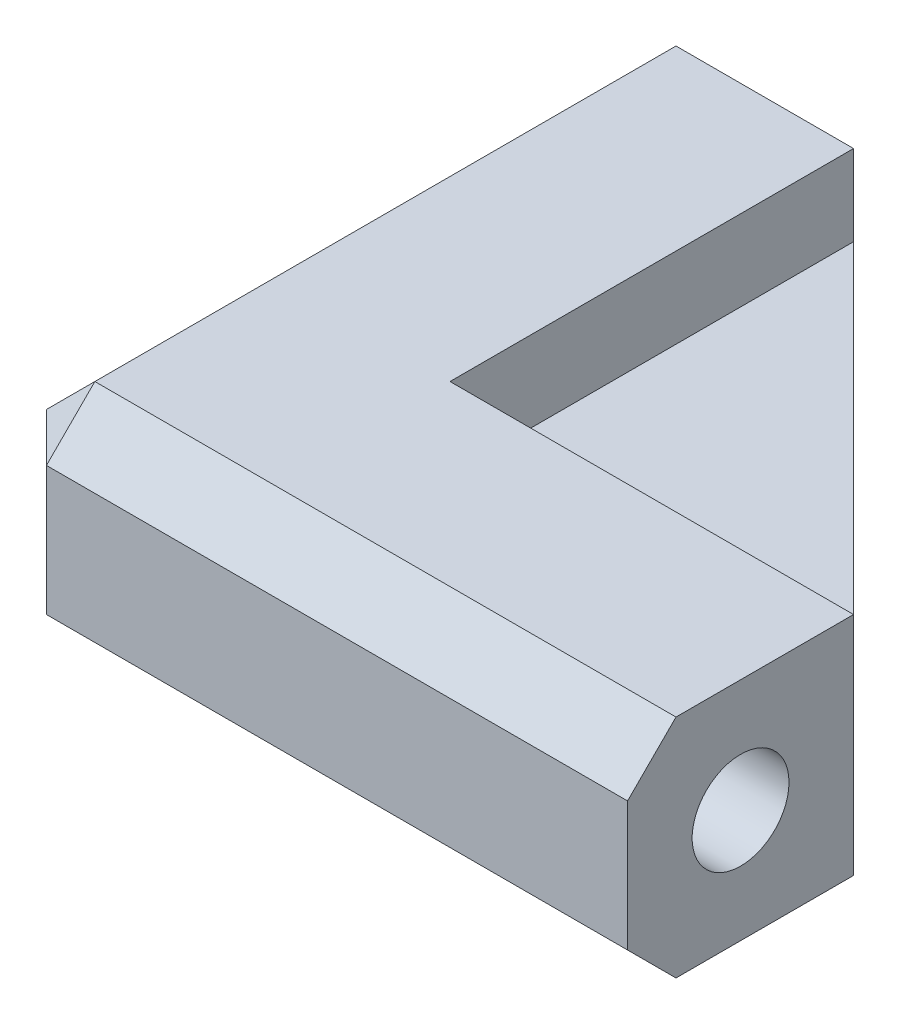
ISO-10303-21;
HEADER;
FILE_DESCRIPTION(('STEP AP214'),'2;1');
FILE_NAME('part.step','',(''),(''),'','','');
FILE_SCHEMA(('AUTOMOTIVE_DESIGN { 1 0 10303 214 1 1 1 1 }'));
ENDSEC;
DATA;
#1=APPLICATION_CONTEXT('core data for automotive mechanical design processes');
#2=APPLICATION_PROTOCOL_DEFINITION('international standard','automotive_design',2000,#1);
#3=PRODUCT_CONTEXT('',#1,'mechanical');
#4=PRODUCT('Part','Part','',(#3));
#5=PRODUCT_RELATED_PRODUCT_CATEGORY('part','',(#4));
#6=PRODUCT_DEFINITION_FORMATION('','',#4);
#7=PRODUCT_DEFINITION_CONTEXT('part definition',#1,'design');
#8=PRODUCT_DEFINITION('design','',#6,#7);
#9=PRODUCT_DEFINITION_SHAPE('','',#8);
#10=(LENGTH_UNIT() NAMED_UNIT(*) SI_UNIT(.MILLI.,.METRE.));
#11=(NAMED_UNIT(*) PLANE_ANGLE_UNIT() SI_UNIT($,.RADIAN.));
#12=(NAMED_UNIT(*) SI_UNIT($,.STERADIAN.) SOLID_ANGLE_UNIT());
#13=UNCERTAINTY_MEASURE_WITH_UNIT(LENGTH_MEASURE(1.E-05),#10,'distance_accuracy_value','');
#14=(GEOMETRIC_REPRESENTATION_CONTEXT(3) GLOBAL_UNCERTAINTY_ASSIGNED_CONTEXT((#13)) GLOBAL_UNIT_ASSIGNED_CONTEXT((#10,
#11,#12)) REPRESENTATION_CONTEXT('',''));
#15=CARTESIAN_POINT('',(0.,0.,0.));
#16=DIRECTION('',(0.,0.,1.));
#17=DIRECTION('',(1.,0.,0.));
#18=AXIS2_PLACEMENT_3D('',#15,#16,#17);
#19=CARTESIAN_POINT('',(16.,3.5,-3.5));
#20=DIRECTION('',(0.,0.,1.));
#21=DIRECTION('',(1.,0.,0.));
#22=AXIS2_PLACEMENT_3D('',#19,#20,#21);
#23=PLANE('',#22);
#24=DIRECTION('',(1.,0.,0.));
#25=VECTOR('',#24,1.);
#26=CARTESIAN_POINT('',(16.,-1.,-3.5));
#27=LINE('',#26,#25);
#28=CARTESIAN_POINT('',(3.5,-1.,-3.5));
#29=VERTEX_POINT('',#28);
#30=CARTESIAN_POINT('',(16.,-1.,-3.5));
#31=VERTEX_POINT('',#30);
#32=EDGE_CURVE('E167',#29,#31,#27,.T.);
#33=ORIENTED_EDGE('',*,*,#32,.T.);
#34=DIRECTION('',(0.,-1.,0.));
#35=VECTOR('',#34,1.);
#36=CARTESIAN_POINT('',(16.,3.5,-3.5));
#37=LINE('',#36,#35);
#38=CARTESIAN_POINT('',(16.,-3.5,-3.5));
#39=VERTEX_POINT('',#38);
#40=EDGE_CURVE('E209',#31,#39,#37,.T.);
#41=ORIENTED_EDGE('',*,*,#40,.T.);
#42=DIRECTION('',(-1.,0.,0.));
#43=VECTOR('',#42,1.);
#44=CARTESIAN_POINT('',(16.,-3.5,-3.5));
#45=LINE('',#44,#43);
#46=CARTESIAN_POINT('',(3.5,-3.5,-3.5));
#47=VERTEX_POINT('',#46);
#48=EDGE_CURVE('E201',#39,#47,#45,.T.);
#49=ORIENTED_EDGE('',*,*,#48,.T.);
#50=DIRECTION('',(0.,-1.,0.));
#51=VECTOR('',#50,1.);
#52=CARTESIAN_POINT('',(3.5,3.5,-3.5));
#53=LINE('',#52,#51);
#54=EDGE_CURVE('E205',#29,#47,#53,.T.);
#55=ORIENTED_EDGE('',*,*,#54,.F.);
#56=EDGE_LOOP('',(#33,#41,#49,#55));
#57=FACE_BOUND('',#56,.T.);
#58=ADVANCED_FACE('F38',(#57),#23,.F.);
#59=CARTESIAN_POINT('',(3.5,3.5,-3.5));
#60=DIRECTION('',(-1.,0.,0.));
#61=DIRECTION('',(0.,0.,1.));
#62=AXIS2_PLACEMENT_3D('',#59,#60,#61);
#63=PLANE('',#62);
#64=DIRECTION('',(0.,0.,1.));
#65=VECTOR('',#64,1.);
#66=CARTESIAN_POINT('',(3.5,-1.,-3.5));
#67=LINE('',#66,#65);
#68=CARTESIAN_POINT('',(3.5,-1.,-16.));
#69=VERTEX_POINT('',#68);
#70=EDGE_CURVE('E153',#69,#29,#67,.T.);
#71=ORIENTED_EDGE('',*,*,#70,.T.);
#72=ORIENTED_EDGE('',*,*,#54,.T.);
#73=DIRECTION('',(0.,0.,-1.));
#74=VECTOR('',#73,1.);
#75=CARTESIAN_POINT('',(3.5,-3.5,-3.5));
#76=LINE('',#75,#74);
#77=CARTESIAN_POINT('',(3.5,-3.5,-16.));
#78=VERTEX_POINT('',#77);
#79=EDGE_CURVE('E156',#47,#78,#76,.T.);
#80=ORIENTED_EDGE('',*,*,#79,.T.);
#81=DIRECTION('',(0.,-1.,0.));
#82=VECTOR('',#81,1.);
#83=CARTESIAN_POINT('',(3.5,3.5,-16.));
#84=LINE('',#83,#82);
#85=EDGE_CURVE('E139',#69,#78,#84,.T.);
#86=ORIENTED_EDGE('',*,*,#85,.F.);
#87=EDGE_LOOP('',(#71,#72,#80,#86));
#88=FACE_BOUND('',#87,.T.);
#89=ADVANCED_FACE('F151',(#88),#63,.F.);
#90=CARTESIAN_POINT('',(3.5,3.5,-16.));
#91=DIRECTION('',(0.,0.,1.));
#92=DIRECTION('',(1.,0.,0.));
#93=AXIS2_PLACEMENT_3D('',#90,#91,#92);
#94=PLANE('',#93);
#95=CARTESIAN_POINT('',(0.,0.,-16.));
#96=DIRECTION('',(0.,0.,-1.));
#97=DIRECTION('',(-1.,0.,0.));
#98=AXIS2_PLACEMENT_3D('',#95,#96,#97);
#99=CIRCLE('',#98,1.5);
#100=CARTESIAN_POINT('',(-1.5,0.,-16.));
#101=VERTEX_POINT('',#100);
#102=EDGE_CURVE('E182',#101,#101,#99,.T.);
#103=ORIENTED_EDGE('',*,*,#102,.F.);
#104=EDGE_LOOP('',(#103));
#105=FACE_BOUND('',#104,.T.);
#106=DIRECTION('',(-1.,0.,0.));
#107=VECTOR('',#106,1.);
#108=CARTESIAN_POINT('',(3.5,-3.5,-16.));
#109=LINE('',#108,#107);
#110=CARTESIAN_POINT('',(-2.,-3.5,-16.));
#111=VERTEX_POINT('',#110);
#112=EDGE_CURVE('E188',#78,#111,#109,.T.);
#113=ORIENTED_EDGE('',*,*,#112,.T.);
#114=DIRECTION('',(0.707106781186547,-0.707106781186548,0.));
#115=VECTOR('',#114,1.);
#116=CARTESIAN_POINT('',(-3.5,-2.,-16.));
#117=LINE('',#116,#115);
#118=CARTESIAN_POINT('',(-3.5,-2.,-16.));
#119=VERTEX_POINT('',#118);
#120=EDGE_CURVE('E241',#111,#119,#117,.F.);
#121=ORIENTED_EDGE('',*,*,#120,.T.);
#122=DIRECTION('',(0.,-1.,0.));
#123=VECTOR('',#122,1.);
#124=CARTESIAN_POINT('',(-3.5,3.5,-16.));
#125=LINE('',#124,#123);
#126=CARTESIAN_POINT('',(-3.5,2.,-16.));
#127=VERTEX_POINT('',#126);
#128=EDGE_CURVE('E216',#127,#119,#125,.T.);
#129=ORIENTED_EDGE('',*,*,#128,.F.);
#130=DIRECTION('',(0.707106781186547,0.707106781186548,0.));
#131=VECTOR('',#130,1.);
#132=CARTESIAN_POINT('',(-2.,3.5,-16.));
#133=LINE('',#132,#131);
#134=CARTESIAN_POINT('',(-2.,3.5,-16.));
#135=VERTEX_POINT('',#134);
#136=EDGE_CURVE('E62',#127,#135,#133,.T.);
#137=ORIENTED_EDGE('',*,*,#136,.T.);
#138=DIRECTION('',(-1.,0.,0.));
#139=VECTOR('',#138,1.);
#140=CARTESIAN_POINT('',(3.5,3.5,-16.));
#141=LINE('',#140,#139);
#142=CARTESIAN_POINT('',(3.5,3.5,-16.));
#143=VERTEX_POINT('',#142);
#144=EDGE_CURVE('E191',#143,#135,#141,.T.);
#145=ORIENTED_EDGE('',*,*,#144,.F.);
#146=CARTESIAN_POINT('',(3.5,1.,-16.));
#147=VERTEX_POINT('',#146);
#148=EDGE_CURVE('E142',#143,#147,#84,.T.);
#149=ORIENTED_EDGE('',*,*,#148,.T.);
#150=DIRECTION('',(0.,-1.,0.));
#151=VECTOR('',#150,1.);
#152=CARTESIAN_POINT('',(3.5,1.,-16.));
#153=LINE('',#152,#151);
#154=EDGE_CURVE('E135',#147,#69,#153,.T.);
#155=ORIENTED_EDGE('',*,*,#154,.T.);
#156=ORIENTED_EDGE('',*,*,#85,.T.);
#157=EDGE_LOOP('',(#113,#121,#129,#137,#145,#149,#155,#156));
#158=FACE_BOUND('',#157,.T.);
#159=ADVANCED_FACE('F138',(#105,#158),#94,.F.);
#160=CARTESIAN_POINT('',(-3.5,3.5,-16.));
#161=DIRECTION('',(1.,0.,0.));
#162=DIRECTION('',(0.,0.,-1.));
#163=AXIS2_PLACEMENT_3D('',#160,#161,#162);
#164=PLANE('',#163);
#165=ORIENTED_EDGE('',*,*,#128,.T.);
#166=DIRECTION('',(0.,0.,1.));
#167=VECTOR('',#166,1.);
#168=CARTESIAN_POINT('',(-3.5,-2.,-16.));
#169=LINE('',#168,#167);
#170=CARTESIAN_POINT('',(-3.5,-2.,2.));
#171=VERTEX_POINT('',#170);
#172=EDGE_CURVE('E238',#119,#171,#169,.T.);
#173=ORIENTED_EDGE('',*,*,#172,.T.);
#174=DIRECTION('',(0.,1.,0.));
#175=VECTOR('',#174,1.);
#176=CARTESIAN_POINT('',(-3.5,3.5,2.));
#177=LINE('',#176,#175);
#178=CARTESIAN_POINT('',(-3.5,2.,2.));
#179=VERTEX_POINT('',#178);
#180=EDGE_CURVE('E236',#171,#179,#177,.T.);
#181=ORIENTED_EDGE('',*,*,#180,.T.);
#182=DIRECTION('',(0.,0.,-1.));
#183=VECTOR('',#182,1.);
#184=CARTESIAN_POINT('',(-3.5,2.,-16.));
#185=LINE('',#184,#183);
#186=EDGE_CURVE('E234',#179,#127,#185,.T.);
#187=ORIENTED_EDGE('',*,*,#186,.T.);
#188=EDGE_LOOP('',(#165,#173,#181,#187));
#189=FACE_BOUND('',#188,.T.);
#190=ADVANCED_FACE('F270',(#189),#164,.F.);
#191=CARTESIAN_POINT('',(-3.5,3.5,3.5));
#192=DIRECTION('',(0.,0.,-1.));
#193=DIRECTION('',(-1.,0.,0.));
#194=AXIS2_PLACEMENT_3D('',#191,#192,#193);
#195=PLANE('',#194);
#196=DIRECTION('',(0.,-1.,0.));
#197=VECTOR('',#196,1.);
#198=CARTESIAN_POINT('',(-2.,3.5,3.5));
#199=LINE('',#198,#197);
#200=CARTESIAN_POINT('',(-2.,2.,3.5));
#201=VERTEX_POINT('',#200);
#202=CARTESIAN_POINT('',(-2.,-2.,3.5));
#203=VERTEX_POINT('',#202);
#204=EDGE_CURVE('E221',#201,#203,#199,.T.);
#205=ORIENTED_EDGE('',*,*,#204,.T.);
#206=DIRECTION('',(1.,0.,0.));
#207=VECTOR('',#206,1.);
#208=CARTESIAN_POINT('',(-3.5,-2.,3.5));
#209=LINE('',#208,#207);
#210=CARTESIAN_POINT('',(16.,-2.,3.5));
#211=VERTEX_POINT('',#210);
#212=EDGE_CURVE('E223',#203,#211,#209,.T.);
#213=ORIENTED_EDGE('',*,*,#212,.T.);
#214=DIRECTION('',(0.,-1.,0.));
#215=VECTOR('',#214,1.);
#216=CARTESIAN_POINT('',(16.,3.5,3.5));
#217=LINE('',#216,#215);
#218=CARTESIAN_POINT('',(16.,2.,3.5));
#219=VERTEX_POINT('',#218);
#220=EDGE_CURVE('E213',#219,#211,#217,.T.);
#221=ORIENTED_EDGE('',*,*,#220,.F.);
#222=DIRECTION('',(-1.,0.,0.));
#223=VECTOR('',#222,1.);
#224=CARTESIAN_POINT('',(-3.5,2.,3.5));
#225=LINE('',#224,#223);
#226=EDGE_CURVE('E219',#219,#201,#225,.T.);
#227=ORIENTED_EDGE('',*,*,#226,.T.);
#228=EDGE_LOOP('',(#205,#213,#221,#227));
#229=FACE_BOUND('',#228,.T.);
#230=ADVANCED_FACE('F283',(#229),#195,.F.);
#231=CARTESIAN_POINT('',(16.,3.5,3.5));
#232=DIRECTION('',(-1.,0.,0.));
#233=DIRECTION('',(0.,0.,1.));
#234=AXIS2_PLACEMENT_3D('',#231,#232,#233);
#235=PLANE('',#234);
#236=CARTESIAN_POINT('',(16.,0.,0.));
#237=DIRECTION('',(1.,0.,0.));
#238=DIRECTION('',(0.,0.,-1.));
#239=AXIS2_PLACEMENT_3D('',#236,#237,#238);
#240=CIRCLE('',#239,1.5);
#241=CARTESIAN_POINT('',(16.,0.,-1.5));
#242=VERTEX_POINT('',#241);
#243=EDGE_CURVE('E178',#242,#242,#240,.T.);
#244=ORIENTED_EDGE('',*,*,#243,.F.);
#245=EDGE_LOOP('',(#244));
#246=FACE_BOUND('',#245,.T.);
#247=ORIENTED_EDGE('',*,*,#220,.T.);
#248=DIRECTION('',(0.,0.707106781186547,0.707106781186548));
#249=VECTOR('',#248,1.);
#250=CARTESIAN_POINT('',(16.,-2.,3.5));
#251=LINE('',#250,#249);
#252=CARTESIAN_POINT('',(16.,-3.5,2.));
#253=VERTEX_POINT('',#252);
#254=EDGE_CURVE('E228',#211,#253,#251,.F.);
#255=ORIENTED_EDGE('',*,*,#254,.T.);
#256=DIRECTION('',(0.,0.,-1.));
#257=VECTOR('',#256,1.);
#258=CARTESIAN_POINT('',(16.,-3.5,3.5));
#259=LINE('',#258,#257);
#260=EDGE_CURVE('E199',#253,#39,#259,.T.);
#261=ORIENTED_EDGE('',*,*,#260,.T.);
#262=ORIENTED_EDGE('',*,*,#40,.F.);
#263=DIRECTION('',(0.,-1.,0.));
#264=VECTOR('',#263,1.);
#265=CARTESIAN_POINT('',(16.,1.,-3.5));
#266=LINE('',#265,#264);
#267=CARTESIAN_POINT('',(16.,1.,-3.5));
#268=VERTEX_POINT('',#267);
#269=EDGE_CURVE('E147',#268,#31,#266,.T.);
#270=ORIENTED_EDGE('',*,*,#269,.F.);
#271=CARTESIAN_POINT('',(16.,3.5,-3.5));
#272=VERTEX_POINT('',#271);
#273=EDGE_CURVE('E210',#272,#268,#37,.T.);
#274=ORIENTED_EDGE('',*,*,#273,.F.);
#275=DIRECTION('',(0.,0.,-1.));
#276=VECTOR('',#275,1.);
#277=CARTESIAN_POINT('',(16.,3.5,3.5));
#278=LINE('',#277,#276);
#279=CARTESIAN_POINT('',(16.,3.5,2.));
#280=VERTEX_POINT('',#279);
#281=EDGE_CURVE('E193',#280,#272,#278,.T.);
#282=ORIENTED_EDGE('',*,*,#281,.F.);
#283=DIRECTION('',(0.,-0.707106781186548,0.707106781186547));
#284=VECTOR('',#283,1.);
#285=CARTESIAN_POINT('',(16.,3.5,2.));
#286=LINE('',#285,#284);
#287=EDGE_CURVE('E226',#280,#219,#286,.T.);
#288=ORIENTED_EDGE('',*,*,#287,.T.);
#289=EDGE_LOOP('',(#247,#255,#261,#262,#270,#274,#282,#288));
#290=FACE_BOUND('',#289,.T.);
#291=ADVANCED_FACE('F287',(#246,#290),#235,.F.);
#292=ORIENTED_EDGE('',*,*,#273,.T.);
#293=DIRECTION('',(1.,0.,0.));
#294=VECTOR('',#293,1.);
#295=CARTESIAN_POINT('',(16.,1.,-3.5));
#296=LINE('',#295,#294);
#297=CARTESIAN_POINT('',(3.5,1.,-3.5));
#298=VERTEX_POINT('',#297);
#299=EDGE_CURVE('E297',#298,#268,#296,.T.);
#300=ORIENTED_EDGE('',*,*,#299,.F.);
#301=CARTESIAN_POINT('',(3.5,3.5,-3.5));
#302=VERTEX_POINT('',#301);
#303=EDGE_CURVE('E206',#302,#298,#53,.T.);
#304=ORIENTED_EDGE('',*,*,#303,.F.);
#305=DIRECTION('',(-1.,0.,0.));
#306=VECTOR('',#305,1.);
#307=CARTESIAN_POINT('',(16.,3.5,-3.5));
#308=LINE('',#307,#306);
#309=EDGE_CURVE('E195',#272,#302,#308,.T.);
#310=ORIENTED_EDGE('',*,*,#309,.F.);
#311=EDGE_LOOP('',(#292,#300,#304,#310));
#312=FACE_BOUND('',#311,.T.);
#313=ADVANCED_FACE('F295',(#312),#23,.F.);
#314=ORIENTED_EDGE('',*,*,#303,.T.);
#315=DIRECTION('',(0.,0.,1.));
#316=VECTOR('',#315,1.);
#317=CARTESIAN_POINT('',(3.5,1.,-3.5));
#318=LINE('',#317,#316);
#319=EDGE_CURVE('E166',#147,#298,#318,.T.);
#320=ORIENTED_EDGE('',*,*,#319,.F.);
#321=ORIENTED_EDGE('',*,*,#148,.F.);
#322=DIRECTION('',(0.,0.,-1.));
#323=VECTOR('',#322,1.);
#324=CARTESIAN_POINT('',(3.5,3.5,-3.5));
#325=LINE('',#324,#323);
#326=EDGE_CURVE('E158',#302,#143,#325,.T.);
#327=ORIENTED_EDGE('',*,*,#326,.F.);
#328=EDGE_LOOP('',(#314,#320,#321,#327));
#329=FACE_BOUND('',#328,.T.);
#330=ADVANCED_FACE('F300',(#329),#63,.F.);
#331=CARTESIAN_POINT('',(0.,3.5,0.));
#332=DIRECTION('',(0.,1.,0.));
#333=DIRECTION('',(0.,0.,1.));
#334=AXIS2_PLACEMENT_3D('',#331,#332,#333);
#335=PLANE('',#334);
#336=DIRECTION('',(0.,0.,1.));
#337=VECTOR('',#336,1.);
#338=CARTESIAN_POINT('',(-2.,3.5,3.5));
#339=LINE('',#338,#337);
#340=CARTESIAN_POINT('',(-2.,3.5,2.));
#341=VERTEX_POINT('',#340);
#342=EDGE_CURVE('E48',#135,#341,#339,.T.);
#343=ORIENTED_EDGE('',*,*,#342,.T.);
#344=DIRECTION('',(1.,0.,0.));
#345=VECTOR('',#344,1.);
#346=CARTESIAN_POINT('',(16.,3.5,2.));
#347=LINE('',#346,#345);
#348=EDGE_CURVE('E11',#341,#280,#347,.T.);
#349=ORIENTED_EDGE('',*,*,#348,.T.);
#350=ORIENTED_EDGE('',*,*,#281,.T.);
#351=ORIENTED_EDGE('',*,*,#309,.T.);
#352=ORIENTED_EDGE('',*,*,#326,.T.);
#353=ORIENTED_EDGE('',*,*,#144,.T.);
#354=EDGE_LOOP('',(#343,#349,#350,#351,#352,#353));
#355=FACE_BOUND('',#354,.T.);
#356=ADVANCED_FACE('F291',(#355),#335,.T.);
#357=CARTESIAN_POINT('',(0.,-3.5,0.));
#358=DIRECTION('',(0.,1.,0.));
#359=DIRECTION('',(0.,0.,1.));
#360=AXIS2_PLACEMENT_3D('',#357,#358,#359);
#361=PLANE('',#360);
#362=ORIENTED_EDGE('',*,*,#260,.F.);
#363=DIRECTION('',(-1.,0.,0.));
#364=VECTOR('',#363,1.);
#365=CARTESIAN_POINT('',(0.,-3.5,2.));
#366=LINE('',#365,#364);
#367=CARTESIAN_POINT('',(-2.,-3.5,2.));
#368=VERTEX_POINT('',#367);
#369=EDGE_CURVE('E232',#253,#368,#366,.T.);
#370=ORIENTED_EDGE('',*,*,#369,.T.);
#371=DIRECTION('',(0.,0.,-1.));
#372=VECTOR('',#371,1.);
#373=CARTESIAN_POINT('',(-2.,-3.5,0.));
#374=LINE('',#373,#372);
#375=EDGE_CURVE('E230',#368,#111,#374,.T.);
#376=ORIENTED_EDGE('',*,*,#375,.T.);
#377=ORIENTED_EDGE('',*,*,#112,.F.);
#378=ORIENTED_EDGE('',*,*,#79,.F.);
#379=ORIENTED_EDGE('',*,*,#48,.F.);
#380=EDGE_LOOP('',(#362,#370,#376,#377,#378,#379));
#381=FACE_BOUND('',#380,.T.);
#382=ADVANCED_FACE('F414',(#381),#361,.F.);
#383=CARTESIAN_POINT('',(0.,0.,-2.));
#384=DIRECTION('',(0.,0.,-1.));
#385=DIRECTION('',(-1.,0.,0.));
#386=AXIS2_PLACEMENT_3D('',#383,#384,#385);
#387=CYLINDRICAL_SURFACE('',#386,1.5);
#388=CARTESIAN_POINT('',(0.,0.,-2.));
#389=DIRECTION('',(0.,0.,-1.));
#390=DIRECTION('',(-1.,0.,0.));
#391=AXIS2_PLACEMENT_3D('',#388,#389,#390);
#392=CIRCLE('',#391,1.5);
#393=CARTESIAN_POINT('',(-1.5,0.,-2.));
#394=VERTEX_POINT('',#393);
#395=EDGE_CURVE('E185',#394,#394,#392,.T.);
#396=ORIENTED_EDGE('',*,*,#395,.F.);
#397=EDGE_LOOP('',(#396));
#398=FACE_BOUND('',#397,.T.);
#399=ORIENTED_EDGE('',*,*,#102,.T.);
#400=EDGE_LOOP('',(#399));
#401=FACE_BOUND('',#400,.T.);
#402=ADVANCED_FACE('F423',(#398,#401),#387,.F.);
#403=CARTESIAN_POINT('',(0.,0.,-2.));
#404=DIRECTION('',(0.,0.,-1.));
#405=DIRECTION('',(-1.,0.,0.));
#406=AXIS2_PLACEMENT_3D('',#403,#404,#405);
#407=PLANE('',#406);
#408=ORIENTED_EDGE('',*,*,#395,.T.);
#409=EDGE_LOOP('',(#408));
#410=FACE_BOUND('',#409,.T.);
#411=ADVANCED_FACE('F434',(#410),#407,.T.);
#412=CARTESIAN_POINT('',(2.,0.,0.));
#413=DIRECTION('',(1.,0.,0.));
#414=DIRECTION('',(0.,0.,-1.));
#415=AXIS2_PLACEMENT_3D('',#412,#413,#414);
#416=CYLINDRICAL_SURFACE('',#415,1.5);
#417=CARTESIAN_POINT('',(2.,0.,0.));
#418=DIRECTION('',(1.,0.,0.));
#419=DIRECTION('',(0.,0.,-1.));
#420=AXIS2_PLACEMENT_3D('',#417,#418,#419);
#421=CIRCLE('',#420,1.5);
#422=CARTESIAN_POINT('',(2.,0.,-1.5));
#423=VERTEX_POINT('',#422);
#424=EDGE_CURVE('E179',#423,#423,#421,.T.);
#425=ORIENTED_EDGE('',*,*,#424,.F.);
#426=EDGE_LOOP('',(#425));
#427=FACE_BOUND('',#426,.T.);
#428=ORIENTED_EDGE('',*,*,#243,.T.);
#429=EDGE_LOOP('',(#428));
#430=FACE_BOUND('',#429,.T.);
#431=ADVANCED_FACE('F441',(#427,#430),#416,.F.);
#432=CARTESIAN_POINT('',(2.,0.,0.));
#433=DIRECTION('',(1.,0.,0.));
#434=DIRECTION('',(0.,0.,-1.));
#435=AXIS2_PLACEMENT_3D('',#432,#433,#434);
#436=PLANE('',#435);
#437=ORIENTED_EDGE('',*,*,#424,.T.);
#438=EDGE_LOOP('',(#437));
#439=FACE_BOUND('',#438,.T.);
#440=ADVANCED_FACE('F311',(#439),#436,.T.);
#441=CARTESIAN_POINT('',(3.5,1.,-16.));
#442=DIRECTION('',(-0.707106781186547,0.,0.707106781186547));
#443=DIRECTION('',(0.707106781186548,0.,0.707106781186548));
#444=AXIS2_PLACEMENT_3D('',#441,#442,#443);
#445=PLANE('',#444);
#446=DIRECTION('',(-0.707106781186547,0.,-0.707106781186547));
#447=VECTOR('',#446,1.);
#448=CARTESIAN_POINT('',(3.5,-1.,-16.));
#449=LINE('',#448,#447);
#450=EDGE_CURVE('E162',#31,#69,#449,.T.);
#451=ORIENTED_EDGE('',*,*,#450,.T.);
#452=ORIENTED_EDGE('',*,*,#154,.F.);
#453=DIRECTION('',(-0.707106781186547,0.,-0.707106781186547));
#454=VECTOR('',#453,1.);
#455=CARTESIAN_POINT('',(3.5,1.,-16.));
#456=LINE('',#455,#454);
#457=EDGE_CURVE('E148',#268,#147,#456,.T.);
#458=ORIENTED_EDGE('',*,*,#457,.F.);
#459=ORIENTED_EDGE('',*,*,#269,.T.);
#460=EDGE_LOOP('',(#451,#452,#458,#459));
#461=FACE_BOUND('',#460,.T.);
#462=ADVANCED_FACE('F163',(#461),#445,.F.);
#463=CARTESIAN_POINT('',(0.,1.,0.));
#464=DIRECTION('',(0.,1.,0.));
#465=DIRECTION('',(0.,0.,1.));
#466=AXIS2_PLACEMENT_3D('',#463,#464,#465);
#467=PLANE('',#466);
#468=ORIENTED_EDGE('',*,*,#319,.T.);
#469=ORIENTED_EDGE('',*,*,#299,.T.);
#470=ORIENTED_EDGE('',*,*,#457,.T.);
#471=EDGE_LOOP('',(#468,#469,#470));
#472=FACE_BOUND('',#471,.T.);
#473=ADVANCED_FACE('F303',(#472),#467,.T.);
#474=CARTESIAN_POINT('',(0.,-1.,0.));
#475=DIRECTION('',(0.,1.,0.));
#476=DIRECTION('',(0.,0.,1.));
#477=AXIS2_PLACEMENT_3D('',#474,#475,#476);
#478=PLANE('',#477);
#479=ORIENTED_EDGE('',*,*,#70,.F.);
#480=ORIENTED_EDGE('',*,*,#450,.F.);
#481=ORIENTED_EDGE('',*,*,#32,.F.);
#482=EDGE_LOOP('',(#479,#480,#481));
#483=FACE_BOUND('',#482,.T.);
#484=ADVANCED_FACE('F169',(#483),#478,.F.);
#485=CARTESIAN_POINT('',(-2.,3.5,0.));
#486=DIRECTION('',(-0.707106781186548,0.707106781186547,0.));
#487=DIRECTION('',(0.,0.,-1.));
#488=AXIS2_PLACEMENT_3D('',#485,#486,#487);
#489=PLANE('',#488);
#490=ORIENTED_EDGE('',*,*,#136,.F.);
#491=ORIENTED_EDGE('',*,*,#186,.F.);
#492=DIRECTION('',(-0.707106781186546,-0.707106781186548,0.));
#493=VECTOR('',#492,1.);
#494=CARTESIAN_POINT('',(-3.5,2.,2.));
#495=LINE('',#494,#493);
#496=EDGE_CURVE('E43',#341,#179,#495,.T.);
#497=ORIENTED_EDGE('',*,*,#496,.F.);
#498=ORIENTED_EDGE('',*,*,#342,.F.);
#499=EDGE_LOOP('',(#490,#491,#497,#498));
#500=FACE_BOUND('',#499,.T.);
#501=ADVANCED_FACE('F41',(#500),#489,.T.);
#502=CARTESIAN_POINT('',(0.,3.5,2.));
#503=DIRECTION('',(0.,0.707106781186547,0.707106781186548));
#504=DIRECTION('',(-1.,0.,0.));
#505=AXIS2_PLACEMENT_3D('',#502,#503,#504);
#506=PLANE('',#505);
#507=ORIENTED_EDGE('',*,*,#287,.F.);
#508=ORIENTED_EDGE('',*,*,#348,.F.);
#509=DIRECTION('',(0.,0.707106781186548,-0.707106781186547));
#510=VECTOR('',#509,1.);
#511=CARTESIAN_POINT('',(-2.,2.75,2.75));
#512=LINE('',#511,#510);
#513=EDGE_CURVE('E173',#201,#341,#512,.T.);
#514=ORIENTED_EDGE('',*,*,#513,.F.);
#515=ORIENTED_EDGE('',*,*,#226,.F.);
#516=EDGE_LOOP('',(#507,#508,#514,#515));
#517=FACE_BOUND('',#516,.T.);
#518=ADVANCED_FACE('F265',(#517),#506,.T.);
#519=CARTESIAN_POINT('',(-3.5,2.,2.));
#520=DIRECTION('',(-0.577350269189627,0.577350269189624,0.577350269189626));
#521=DIRECTION('',(0.707106781186546,0.,0.707106781186548));
#522=AXIS2_PLACEMENT_3D('',#519,#520,#521);
#523=PLANE('',#522);
#524=ORIENTED_EDGE('',*,*,#513,.T.);
#525=ORIENTED_EDGE('',*,*,#496,.T.);
#526=DIRECTION('',(-0.707106781186546,0.,-0.707106781186548));
#527=VECTOR('',#526,1.);
#528=CARTESIAN_POINT('',(-3.5,2.,2.));
#529=LINE('',#528,#527);
#530=EDGE_CURVE('E253',#201,#179,#529,.T.);
#531=ORIENTED_EDGE('',*,*,#530,.F.);
#532=EDGE_LOOP('',(#524,#525,#531));
#533=FACE_BOUND('',#532,.T.);
#534=ADVANCED_FACE('F259',(#533),#523,.T.);
#535=CARTESIAN_POINT('',(-3.5,-2.,-16.));
#536=DIRECTION('',(0.707106781186548,0.707106781186547,0.));
#537=DIRECTION('',(0.,0.,1.));
#538=AXIS2_PLACEMENT_3D('',#535,#536,#537);
#539=PLANE('',#538);
#540=ORIENTED_EDGE('',*,*,#120,.F.);
#541=ORIENTED_EDGE('',*,*,#375,.F.);
#542=DIRECTION('',(-0.707106781186547,0.707106781186548,0.));
#543=VECTOR('',#542,1.);
#544=CARTESIAN_POINT('',(-2.,-3.5,2.));
#545=LINE('',#544,#543);
#546=EDGE_CURVE('E250',#171,#368,#545,.F.);
#547=ORIENTED_EDGE('',*,*,#546,.F.);
#548=ORIENTED_EDGE('',*,*,#172,.F.);
#549=EDGE_LOOP('',(#540,#541,#547,#548));
#550=FACE_BOUND('',#549,.T.);
#551=ADVANCED_FACE('F276',(#550),#539,.F.);
#552=CARTESIAN_POINT('',(-2.,3.5,3.5));
#553=DIRECTION('',(0.707106781186548,0.,-0.707106781186547));
#554=DIRECTION('',(0.,-1.,0.));
#555=AXIS2_PLACEMENT_3D('',#552,#553,#554);
#556=PLANE('',#555);
#557=ORIENTED_EDGE('',*,*,#530,.T.);
#558=ORIENTED_EDGE('',*,*,#180,.F.);
#559=DIRECTION('',(0.707106781186547,0.,0.707106781186548));
#560=VECTOR('',#559,1.);
#561=CARTESIAN_POINT('',(-2.75,-2.,2.75));
#562=LINE('',#561,#560);
#563=EDGE_CURVE('E247',#203,#171,#562,.F.);
#564=ORIENTED_EDGE('',*,*,#563,.F.);
#565=ORIENTED_EDGE('',*,*,#204,.F.);
#566=EDGE_LOOP('',(#557,#558,#564,#565));
#567=FACE_BOUND('',#566,.T.);
#568=ADVANCED_FACE('F280',(#567),#556,.F.);
#569=CARTESIAN_POINT('',(-2.,-3.5,2.));
#570=DIRECTION('',(-0.577350269189627,-0.577350269189626,0.577350269189624));
#571=DIRECTION('',(0.707106781186546,-0.707106781186549,0.));
#572=AXIS2_PLACEMENT_3D('',#569,#570,#571);
#573=PLANE('',#572);
#574=ORIENTED_EDGE('',*,*,#563,.T.);
#575=ORIENTED_EDGE('',*,*,#546,.T.);
#576=DIRECTION('',(0.,-0.707106781186547,-0.707106781186548));
#577=VECTOR('',#576,1.);
#578=CARTESIAN_POINT('',(-2.,-3.5,2.));
#579=LINE('',#578,#577);
#580=EDGE_CURVE('E244',#203,#368,#579,.T.);
#581=ORIENTED_EDGE('',*,*,#580,.F.);
#582=EDGE_LOOP('',(#574,#575,#581));
#583=FACE_BOUND('',#582,.T.);
#584=ADVANCED_FACE('F345',(#583),#573,.T.);
#585=CARTESIAN_POINT('',(-3.5,-2.,3.5));
#586=DIRECTION('',(0.,0.707106781186548,-0.707106781186547));
#587=DIRECTION('',(1.,0.,0.));
#588=AXIS2_PLACEMENT_3D('',#585,#586,#587);
#589=PLANE('',#588);
#590=ORIENTED_EDGE('',*,*,#580,.T.);
#591=ORIENTED_EDGE('',*,*,#369,.F.);
#592=ORIENTED_EDGE('',*,*,#254,.F.);
#593=ORIENTED_EDGE('',*,*,#212,.F.);
#594=EDGE_LOOP('',(#590,#591,#592,#593));
#595=FACE_BOUND('',#594,.T.);
#596=ADVANCED_FACE('F339',(#595),#589,.F.);
#597=CLOSED_SHELL('',(#58,#89,#159,#190,#230,#291,#313,#330,#356,#382,#402,#411,#431,#440,#462,
#473,#484,#501,#518,#534,#551,#568,#584,#596));
#598=MANIFOLD_SOLID_BREP('B2',#597);
#599=ADVANCED_BREP_SHAPE_REPRESENTATION('',(#18,#598),#14);
#600=SHAPE_DEFINITION_REPRESENTATION(#9,#599);
ENDSEC;
END-ISO-10303-21;
